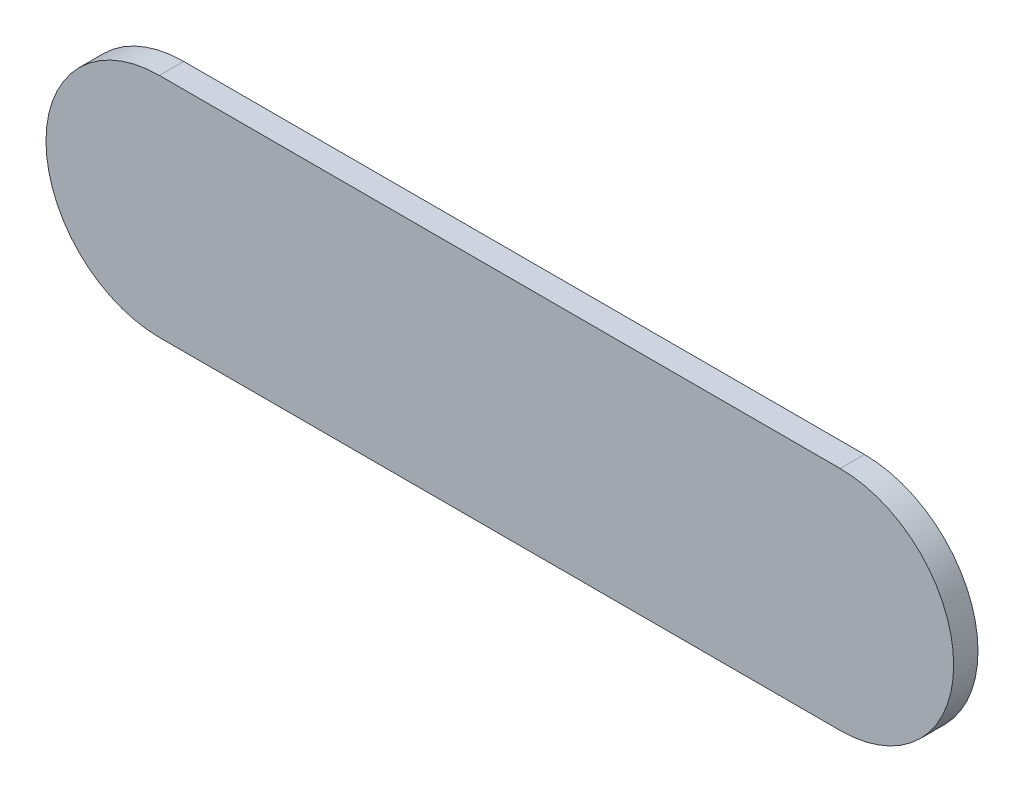
ISO-10303-21;
HEADER;
FILE_DESCRIPTION(('STEP AP214'),'2;1');
FILE_NAME('part.step','',(''),(''),'','','');
FILE_SCHEMA(('AUTOMOTIVE_DESIGN { 1 0 10303 214 1 1 1 1 }'));
ENDSEC;
DATA;
#1=APPLICATION_CONTEXT('core data for automotive mechanical design processes');
#2=APPLICATION_PROTOCOL_DEFINITION('international standard','automotive_design',2000,#1);
#3=PRODUCT_CONTEXT('',#1,'mechanical');
#4=PRODUCT('Part','Part','',(#3));
#5=PRODUCT_RELATED_PRODUCT_CATEGORY('part','',(#4));
#6=PRODUCT_DEFINITION_FORMATION('','',#4);
#7=PRODUCT_DEFINITION_CONTEXT('part definition',#1,'design');
#8=PRODUCT_DEFINITION('design','',#6,#7);
#9=PRODUCT_DEFINITION_SHAPE('','',#8);
#10=(LENGTH_UNIT() NAMED_UNIT(*) SI_UNIT(.MILLI.,.METRE.));
#11=(NAMED_UNIT(*) PLANE_ANGLE_UNIT() SI_UNIT($,.RADIAN.));
#12=(NAMED_UNIT(*) SI_UNIT($,.STERADIAN.) SOLID_ANGLE_UNIT());
#13=UNCERTAINTY_MEASURE_WITH_UNIT(LENGTH_MEASURE(1.E-05),#10,'distance_accuracy_value','');
#14=(GEOMETRIC_REPRESENTATION_CONTEXT(3) GLOBAL_UNCERTAINTY_ASSIGNED_CONTEXT((#13)) GLOBAL_UNIT_ASSIGNED_CONTEXT((#10,
#11,#12)) REPRESENTATION_CONTEXT('',''));
#15=CARTESIAN_POINT('',(0.,0.,0.));
#16=DIRECTION('',(0.,0.,1.));
#17=DIRECTION('',(1.,0.,0.));
#18=AXIS2_PLACEMENT_3D('',#15,#16,#17);
#19=CARTESIAN_POINT('',(4.062247988433,-1.198389894734,0.));
#20=DIRECTION('',(0.,-1.,0.));
#21=DIRECTION('',(1.,0.,0.));
#22=AXIS2_PLACEMENT_3D('',#19,#20,#21);
#23=PLANE('',#22);
#24=DIRECTION('',(-1.,0.,0.));
#25=VECTOR('',#24,1.);
#26=CARTESIAN_POINT('',(6.861607988433,-1.198389894734,0.));
#27=LINE('',#26,#25);
#28=CARTESIAN_POINT('',(6.861607988433,-1.198389894734,0.));
#29=VERTEX_POINT('',#28);
#30=CARTESIAN_POINT('',(4.062247988433,-1.198389894734,0.));
#31=VERTEX_POINT('',#30);
#32=EDGE_CURVE('E11',#29,#31,#27,.T.);
#33=ORIENTED_EDGE('',*,*,#32,.F.);
#34=DIRECTION('',(0.,0.,1.));
#35=VECTOR('',#34,1.);
#36=CARTESIAN_POINT('',(6.861607988433,-1.198389894734,0.));
#37=LINE('',#36,#35);
#38=CARTESIAN_POINT('',(6.861607988433,-1.198389894734,0.1));
#39=VERTEX_POINT('',#38);
#40=EDGE_CURVE('E24',#29,#39,#37,.T.);
#41=ORIENTED_EDGE('',*,*,#40,.T.);
#42=DIRECTION('',(1.,0.,0.));
#43=VECTOR('',#42,1.);
#44=CARTESIAN_POINT('',(6.861607988433,-1.198389894734,0.1));
#45=LINE('',#44,#43);
#46=CARTESIAN_POINT('',(4.062247988433,-1.198389894734,0.1));
#47=VERTEX_POINT('',#46);
#48=EDGE_CURVE('E75',#47,#39,#45,.T.);
#49=ORIENTED_EDGE('',*,*,#48,.F.);
#50=DIRECTION('',(0.,0.,1.));
#51=VECTOR('',#50,1.);
#52=CARTESIAN_POINT('',(4.062247988433,-1.198389894734,0.));
#53=LINE('',#52,#51);
#54=EDGE_CURVE('E85',#31,#47,#53,.T.);
#55=ORIENTED_EDGE('',*,*,#54,.F.);
#56=EDGE_LOOP('',(#33,#41,#49,#55));
#57=FACE_BOUND('',#56,.T.);
#58=ADVANCED_FACE('F17',(#57),#23,.T.);
#59=CARTESIAN_POINT('',(4.062247988433,-0.73182989473394,0.));
#60=DIRECTION('',(0.,0.,1.));
#61=DIRECTION('',(0.,-1.,0.));
#62=AXIS2_PLACEMENT_3D('',#59,#60,#61);
#63=CYLINDRICAL_SURFACE('',#62,0.466560000000001);
#64=CARTESIAN_POINT('',(4.062247988433,-0.731829894733938,0.));
#65=DIRECTION('',(0.,0.,-1.));
#66=DIRECTION('',(1.,0.,0.));
#67=AXIS2_PLACEMENT_3D('',#64,#65,#66);
#68=CIRCLE('',#67,0.46656);
#69=CARTESIAN_POINT('',(4.062247988433,-0.265269894733934,0.));
#70=VERTEX_POINT('',#69);
#71=EDGE_CURVE('E83',#31,#70,#68,.T.);
#72=ORIENTED_EDGE('',*,*,#71,.F.);
#73=ORIENTED_EDGE('',*,*,#54,.T.);
#74=CARTESIAN_POINT('',(4.062247988433,-0.73182989473394,0.1));
#75=DIRECTION('',(0.,0.,1.));
#76=DIRECTION('',(0.,-1.,0.));
#77=AXIS2_PLACEMENT_3D('',#74,#75,#76);
#78=CIRCLE('',#77,0.466560000000001);
#79=CARTESIAN_POINT('',(4.062247988433,-0.265269894733934,0.1));
#80=VERTEX_POINT('',#79);
#81=EDGE_CURVE('E81',#80,#47,#78,.T.);
#82=ORIENTED_EDGE('',*,*,#81,.F.);
#83=DIRECTION('',(0.,0.,1.));
#84=VECTOR('',#83,1.);
#85=CARTESIAN_POINT('',(4.062247988433,-0.265269894733934,0.));
#86=LINE('',#85,#84);
#87=EDGE_CURVE('E61',#70,#80,#86,.T.);
#88=ORIENTED_EDGE('',*,*,#87,.F.);
#89=EDGE_LOOP('',(#72,#73,#82,#88));
#90=FACE_BOUND('',#89,.T.);
#91=ADVANCED_FACE('F91',(#90),#63,.T.);
#92=CARTESIAN_POINT('',(6.861607988433,-0.265269894733934,0.));
#93=DIRECTION('',(0.,1.,0.));
#94=DIRECTION('',(-1.,0.,0.));
#95=AXIS2_PLACEMENT_3D('',#92,#93,#94);
#96=PLANE('',#95);
#97=DIRECTION('',(1.,0.,0.));
#98=VECTOR('',#97,1.);
#99=CARTESIAN_POINT('',(4.062247988433,-0.265269894733934,0.));
#100=LINE('',#99,#98);
#101=CARTESIAN_POINT('',(6.861607988433,-0.265269894733934,0.));
#102=VERTEX_POINT('',#101);
#103=EDGE_CURVE('E65',#70,#102,#100,.T.);
#104=ORIENTED_EDGE('',*,*,#103,.F.);
#105=ORIENTED_EDGE('',*,*,#87,.T.);
#106=DIRECTION('',(-1.,0.,0.));
#107=VECTOR('',#106,1.);
#108=CARTESIAN_POINT('',(4.062247988433,-0.265269894733934,0.1));
#109=LINE('',#108,#107);
#110=CARTESIAN_POINT('',(6.861607988433,-0.265269894733934,0.1));
#111=VERTEX_POINT('',#110);
#112=EDGE_CURVE('E54',#111,#80,#109,.T.);
#113=ORIENTED_EDGE('',*,*,#112,.F.);
#114=DIRECTION('',(0.,0.,1.));
#115=VECTOR('',#114,1.);
#116=CARTESIAN_POINT('',(6.861607988433,-0.265269894733934,0.));
#117=LINE('',#116,#115);
#118=EDGE_CURVE('E58',#102,#111,#117,.T.);
#119=ORIENTED_EDGE('',*,*,#118,.F.);
#120=EDGE_LOOP('',(#104,#105,#113,#119));
#121=FACE_BOUND('',#120,.T.);
#122=ADVANCED_FACE('F57',(#121),#96,.T.);
#123=CARTESIAN_POINT('',(6.861607988433,-0.731829894733938,0.));
#124=DIRECTION('',(0.,0.,1.));
#125=DIRECTION('',(0.,1.,0.));
#126=AXIS2_PLACEMENT_3D('',#123,#124,#125);
#127=CYLINDRICAL_SURFACE('',#126,0.46656);
#128=CARTESIAN_POINT('',(6.861607988433,-0.731829894733938,0.));
#129=DIRECTION('',(0.,0.,-1.));
#130=DIRECTION('',(0.,1.,0.));
#131=AXIS2_PLACEMENT_3D('',#128,#129,#130);
#132=CIRCLE('',#131,0.46656);
#133=EDGE_CURVE('E71',#102,#29,#132,.T.);
#134=ORIENTED_EDGE('',*,*,#133,.F.);
#135=ORIENTED_EDGE('',*,*,#118,.T.);
#136=CARTESIAN_POINT('',(6.861607988433,-0.731829894733938,0.1));
#137=DIRECTION('',(0.,0.,1.));
#138=DIRECTION('',(0.,1.,0.));
#139=AXIS2_PLACEMENT_3D('',#136,#137,#138);
#140=CIRCLE('',#139,0.46656);
#141=EDGE_CURVE('E70',#39,#111,#140,.T.);
#142=ORIENTED_EDGE('',*,*,#141,.F.);
#143=ORIENTED_EDGE('',*,*,#40,.F.);
#144=EDGE_LOOP('',(#134,#135,#142,#143));
#145=FACE_BOUND('',#144,.T.);
#146=ADVANCED_FACE('F69',(#145),#127,.T.);
#147=CARTESIAN_POINT('',(5.461927988433,-0.731829894733936,0.));
#148=DIRECTION('',(0.,0.,1.));
#149=DIRECTION('',(1.,0.,0.));
#150=AXIS2_PLACEMENT_3D('',#147,#148,#149);
#151=PLANE('',#150);
#152=ORIENTED_EDGE('',*,*,#133,.T.);
#153=ORIENTED_EDGE('',*,*,#32,.T.);
#154=ORIENTED_EDGE('',*,*,#71,.T.);
#155=ORIENTED_EDGE('',*,*,#103,.T.);
#156=EDGE_LOOP('',(#152,#153,#154,#155));
#157=FACE_BOUND('',#156,.T.);
#158=ADVANCED_FACE('F88',(#157),#151,.F.);
#159=CARTESIAN_POINT('',(5.461927988433,-0.731829894733936,0.1));
#160=DIRECTION('',(0.,0.,1.));
#161=DIRECTION('',(1.,0.,0.));
#162=AXIS2_PLACEMENT_3D('',#159,#160,#161);
#163=PLANE('',#162);
#164=ORIENTED_EDGE('',*,*,#141,.T.);
#165=ORIENTED_EDGE('',*,*,#112,.T.);
#166=ORIENTED_EDGE('',*,*,#81,.T.);
#167=ORIENTED_EDGE('',*,*,#48,.T.);
#168=EDGE_LOOP('',(#164,#165,#166,#167));
#169=FACE_BOUND('',#168,.T.);
#170=ADVANCED_FACE('F74',(#169),#163,.T.);
#171=CLOSED_SHELL('',(#58,#91,#122,#146,#158,#170));
#172=MANIFOLD_SOLID_BREP('B1',#171);
#173=ADVANCED_BREP_SHAPE_REPRESENTATION('',(#18,#172),#14);
#174=SHAPE_DEFINITION_REPRESENTATION(#9,#173);
ENDSEC;
END-ISO-10303-21;
